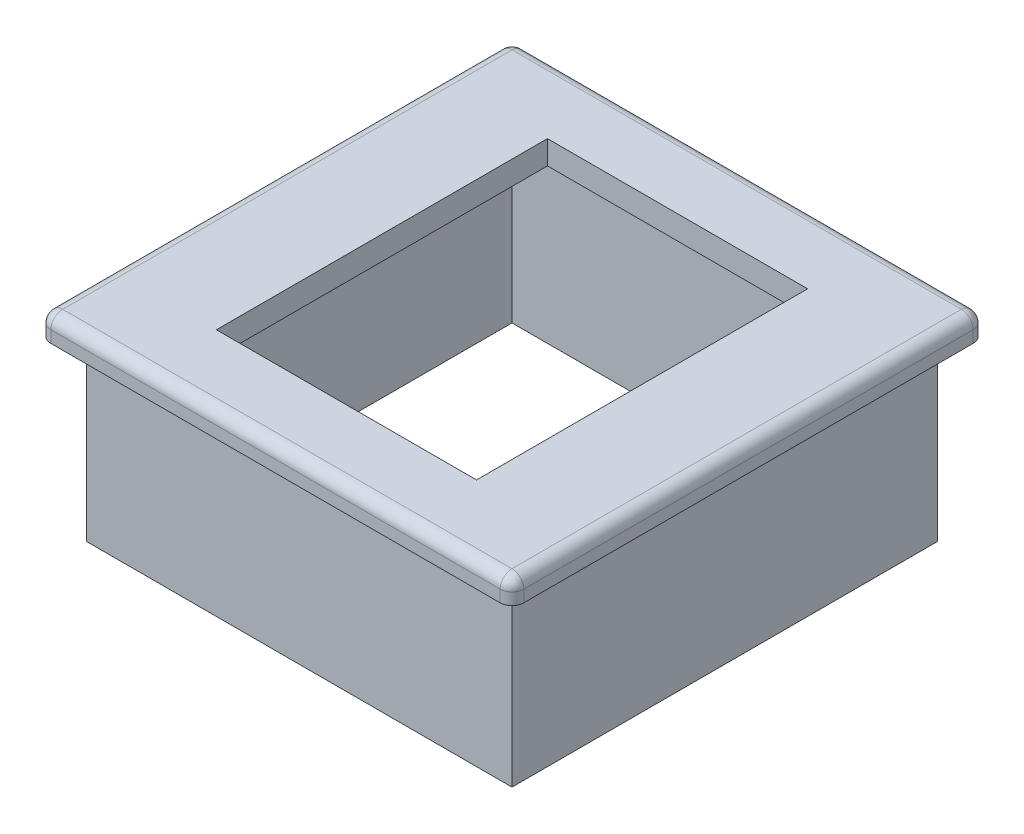
ISO-10303-21;
HEADER;
FILE_DESCRIPTION(('STEP AP214'),'2;1');
FILE_NAME('part.step','',(''),(''),'','','');
FILE_SCHEMA(('AUTOMOTIVE_DESIGN { 1 0 10303 214 1 1 1 1 }'));
ENDSEC;
DATA;
#1=APPLICATION_CONTEXT('core data for automotive mechanical design processes');
#2=APPLICATION_PROTOCOL_DEFINITION('international standard','automotive_design',2000,#1);
#3=PRODUCT_CONTEXT('',#1,'mechanical');
#4=PRODUCT('Part','Part','',(#3));
#5=PRODUCT_RELATED_PRODUCT_CATEGORY('part','',(#4));
#6=PRODUCT_DEFINITION_FORMATION('','',#4);
#7=PRODUCT_DEFINITION_CONTEXT('part definition',#1,'design');
#8=PRODUCT_DEFINITION('design','',#6,#7);
#9=PRODUCT_DEFINITION_SHAPE('','',#8);
#10=(LENGTH_UNIT() NAMED_UNIT(*) SI_UNIT(.MILLI.,.METRE.));
#11=(NAMED_UNIT(*) PLANE_ANGLE_UNIT() SI_UNIT($,.RADIAN.));
#12=(NAMED_UNIT(*) SI_UNIT($,.STERADIAN.) SOLID_ANGLE_UNIT());
#13=UNCERTAINTY_MEASURE_WITH_UNIT(LENGTH_MEASURE(1.E-05),#10,'distance_accuracy_value','');
#14=(GEOMETRIC_REPRESENTATION_CONTEXT(3) GLOBAL_UNCERTAINTY_ASSIGNED_CONTEXT((#13)) GLOBAL_UNIT_ASSIGNED_CONTEXT((#10,
#11,#12)) REPRESENTATION_CONTEXT('',''));
#15=CARTESIAN_POINT('',(0.,0.,0.));
#16=DIRECTION('',(0.,0.,1.));
#17=DIRECTION('',(1.,0.,0.));
#18=AXIS2_PLACEMENT_3D('',#15,#16,#17);
#19=CARTESIAN_POINT('',(0.,0.,0.));
#20=DIRECTION('',(0.,1.,0.));
#21=DIRECTION('',(0.,0.,1.));
#22=AXIS2_PLACEMENT_3D('',#19,#20,#21);
#23=PLANE('',#22);
#24=DIRECTION('',(0.,0.,-1.));
#25=VECTOR('',#24,1.);
#26=CARTESIAN_POINT('',(11.,0.,-14.));
#27=LINE('',#26,#25);
#28=CARTESIAN_POINT('',(11.,0.,14.));
#29=VERTEX_POINT('',#28);
#30=CARTESIAN_POINT('',(11.,0.,-14.));
#31=VERTEX_POINT('',#30);
#32=EDGE_CURVE('E253',#29,#31,#27,.T.);
#33=ORIENTED_EDGE('',*,*,#32,.T.);
#34=DIRECTION('',(-1.,0.,0.));
#35=VECTOR('',#34,1.);
#36=CARTESIAN_POINT('',(-11.,0.,-14.));
#37=LINE('',#36,#35);
#38=CARTESIAN_POINT('',(-11.,0.,-14.));
#39=VERTEX_POINT('',#38);
#40=EDGE_CURVE('E272',#31,#39,#37,.T.);
#41=ORIENTED_EDGE('',*,*,#40,.T.);
#42=DIRECTION('',(0.,0.,1.));
#43=VECTOR('',#42,1.);
#44=CARTESIAN_POINT('',(-11.,0.,-14.));
#45=LINE('',#44,#43);
#46=CARTESIAN_POINT('',(-11.,0.,14.));
#47=VERTEX_POINT('',#46);
#48=EDGE_CURVE('E275',#39,#47,#45,.T.);
#49=ORIENTED_EDGE('',*,*,#48,.T.);
#50=DIRECTION('',(1.,0.,0.));
#51=VECTOR('',#50,1.);
#52=CARTESIAN_POINT('',(-11.,0.,14.));
#53=LINE('',#52,#51);
#54=EDGE_CURVE('E262',#47,#29,#53,.T.);
#55=ORIENTED_EDGE('',*,*,#54,.T.);
#56=EDGE_LOOP('',(#33,#41,#49,#55));
#57=FACE_BOUND('',#56,.T.);
#58=DIRECTION('',(-1.,0.,0.));
#59=VECTOR('',#58,1.);
#60=CARTESIAN_POINT('',(0.,0.,-16.));
#61=LINE('',#60,#59);
#62=CARTESIAN_POINT('',(16.,0.,-16.));
#63=VERTEX_POINT('',#62);
#64=CARTESIAN_POINT('',(-16.,0.,-16.));
#65=VERTEX_POINT('',#64);
#66=EDGE_CURVE('E234',#63,#65,#61,.T.);
#67=ORIENTED_EDGE('',*,*,#66,.F.);
#68=DIRECTION('',(0.,0.,1.));
#69=VECTOR('',#68,1.);
#70=CARTESIAN_POINT('',(16.,0.,0.));
#71=LINE('',#70,#69);
#72=CARTESIAN_POINT('',(16.,0.,16.));
#73=VERTEX_POINT('',#72);
#74=EDGE_CURVE('E203',#63,#73,#71,.T.);
#75=ORIENTED_EDGE('',*,*,#74,.T.);
#76=DIRECTION('',(-1.,0.,0.));
#77=VECTOR('',#76,1.);
#78=CARTESIAN_POINT('',(0.,0.,16.));
#79=LINE('',#78,#77);
#80=CARTESIAN_POINT('',(-16.,0.,16.));
#81=VERTEX_POINT('',#80);
#82=EDGE_CURVE('E240',#73,#81,#79,.T.);
#83=ORIENTED_EDGE('',*,*,#82,.T.);
#84=DIRECTION('',(0.,0.,1.));
#85=VECTOR('',#84,1.);
#86=CARTESIAN_POINT('',(-16.,0.,0.));
#87=LINE('',#86,#85);
#88=EDGE_CURVE('E237',#65,#81,#87,.T.);
#89=ORIENTED_EDGE('',*,*,#88,.F.);
#90=EDGE_LOOP('',(#67,#75,#83,#89));
#91=FACE_BOUND('',#90,.T.);
#92=ADVANCED_FACE('F35',(#57,#91),#23,.F.);
#93=CARTESIAN_POINT('',(0.,2.,0.));
#94=DIRECTION('',(0.,1.,0.));
#95=DIRECTION('',(0.,0.,1.));
#96=AXIS2_PLACEMENT_3D('',#93,#94,#95);
#97=PLANE('',#96);
#98=DIRECTION('',(1.,0.,0.));
#99=VECTOR('',#98,1.);
#100=CARTESIAN_POINT('',(20.,2.,19.));
#101=LINE('',#100,#99);
#102=CARTESIAN_POINT('',(-19.,2.,19.));
#103=VERTEX_POINT('',#102);
#104=CARTESIAN_POINT('',(19.,2.,19.));
#105=VERTEX_POINT('',#104);
#106=EDGE_CURVE('E325',#103,#105,#101,.T.);
#107=ORIENTED_EDGE('',*,*,#106,.T.);
#108=DIRECTION('',(0.,0.,-1.));
#109=VECTOR('',#108,1.);
#110=CARTESIAN_POINT('',(19.,2.,-20.));
#111=LINE('',#110,#109);
#112=CARTESIAN_POINT('',(19.,2.,-19.));
#113=VERTEX_POINT('',#112);
#114=EDGE_CURVE('E327',#105,#113,#111,.T.);
#115=ORIENTED_EDGE('',*,*,#114,.T.);
#116=DIRECTION('',(-1.,0.,0.));
#117=VECTOR('',#116,1.);
#118=CARTESIAN_POINT('',(-20.,2.,-19.));
#119=LINE('',#118,#117);
#120=CARTESIAN_POINT('',(-19.,2.,-19.));
#121=VERTEX_POINT('',#120);
#122=EDGE_CURVE('E321',#113,#121,#119,.T.);
#123=ORIENTED_EDGE('',*,*,#122,.T.);
#124=DIRECTION('',(0.,0.,1.));
#125=VECTOR('',#124,1.);
#126=CARTESIAN_POINT('',(-19.,2.,20.));
#127=LINE('',#126,#125);
#128=EDGE_CURVE('E323',#121,#103,#127,.T.);
#129=ORIENTED_EDGE('',*,*,#128,.T.);
#130=EDGE_LOOP('',(#107,#115,#123,#129));
#131=FACE_BOUND('',#130,.T.);
#132=DIRECTION('',(-1.,0.,0.));
#133=VECTOR('',#132,1.);
#134=CARTESIAN_POINT('',(-11.,2.,-14.));
#135=LINE('',#134,#133);
#136=CARTESIAN_POINT('',(11.,2.,-14.));
#137=VERTEX_POINT('',#136);
#138=CARTESIAN_POINT('',(-11.,2.,-14.));
#139=VERTEX_POINT('',#138);
#140=EDGE_CURVE('E261',#137,#139,#135,.T.);
#141=ORIENTED_EDGE('',*,*,#140,.F.);
#142=DIRECTION('',(0.,0.,-1.));
#143=VECTOR('',#142,1.);
#144=CARTESIAN_POINT('',(11.,2.,-14.));
#145=LINE('',#144,#143);
#146=CARTESIAN_POINT('',(11.,2.,14.));
#147=VERTEX_POINT('',#146);
#148=EDGE_CURVE('E259',#147,#137,#145,.T.);
#149=ORIENTED_EDGE('',*,*,#148,.F.);
#150=DIRECTION('',(1.,0.,0.));
#151=VECTOR('',#150,1.);
#152=CARTESIAN_POINT('',(-11.,2.,14.));
#153=LINE('',#152,#151);
#154=CARTESIAN_POINT('',(-11.,2.,14.));
#155=VERTEX_POINT('',#154);
#156=EDGE_CURVE('E267',#155,#147,#153,.T.);
#157=ORIENTED_EDGE('',*,*,#156,.F.);
#158=DIRECTION('',(0.,0.,1.));
#159=VECTOR('',#158,1.);
#160=CARTESIAN_POINT('',(-11.,2.,-14.));
#161=LINE('',#160,#159);
#162=EDGE_CURVE('E264',#139,#155,#161,.T.);
#163=ORIENTED_EDGE('',*,*,#162,.F.);
#164=EDGE_LOOP('',(#141,#149,#157,#163));
#165=FACE_BOUND('',#164,.T.);
#166=ADVANCED_FACE('F400',(#131,#165),#97,.T.);
#167=DIRECTION('',(1.,0.,0.));
#168=VECTOR('',#167,1.);
#169=CARTESIAN_POINT('',(0.,0.,18.));
#170=LINE('',#169,#168);
#171=CARTESIAN_POINT('',(-18.,0.,18.));
#172=VERTEX_POINT('',#171);
#173=CARTESIAN_POINT('',(18.,0.,18.));
#174=VERTEX_POINT('',#173);
#175=EDGE_CURVE('E226',#172,#174,#170,.T.);
#176=ORIENTED_EDGE('',*,*,#175,.T.);
#177=DIRECTION('',(0.,0.,-1.));
#178=VECTOR('',#177,1.);
#179=CARTESIAN_POINT('',(18.,0.,0.));
#180=LINE('',#179,#178);
#181=CARTESIAN_POINT('',(18.,0.,-18.));
#182=VERTEX_POINT('',#181);
#183=EDGE_CURVE('E188',#174,#182,#180,.T.);
#184=ORIENTED_EDGE('',*,*,#183,.T.);
#185=DIRECTION('',(1.,0.,0.));
#186=VECTOR('',#185,1.);
#187=CARTESIAN_POINT('',(0.,0.,-18.));
#188=LINE('',#187,#186);
#189=CARTESIAN_POINT('',(-18.,0.,-18.));
#190=VERTEX_POINT('',#189);
#191=EDGE_CURVE('E231',#190,#182,#188,.T.);
#192=ORIENTED_EDGE('',*,*,#191,.F.);
#193=DIRECTION('',(0.,0.,-1.));
#194=VECTOR('',#193,1.);
#195=CARTESIAN_POINT('',(-18.,0.,0.));
#196=LINE('',#195,#194);
#197=EDGE_CURVE('E228',#172,#190,#196,.T.);
#198=ORIENTED_EDGE('',*,*,#197,.F.);
#199=EDGE_LOOP('',(#176,#184,#192,#198));
#200=FACE_BOUND('',#199,.T.);
#201=DIRECTION('',(1.,0.,0.));
#202=VECTOR('',#201,1.);
#203=CARTESIAN_POINT('',(-20.,0.,20.));
#204=LINE('',#203,#202);
#205=CARTESIAN_POINT('',(-19.,0.,20.));
#206=VERTEX_POINT('',#205);
#207=CARTESIAN_POINT('',(19.,0.,20.));
#208=VERTEX_POINT('',#207);
#209=EDGE_CURVE('E297',#206,#208,#204,.T.);
#210=ORIENTED_EDGE('',*,*,#209,.F.);
#211=CARTESIAN_POINT('',(-19.,0.,19.));
#212=DIRECTION('',(0.,1.,0.));
#213=DIRECTION('',(0.,0.,1.));
#214=AXIS2_PLACEMENT_3D('',#211,#212,#213);
#215=CIRCLE('',#214,1.);
#216=CARTESIAN_POINT('',(-20.,0.,19.));
#217=VERTEX_POINT('',#216);
#218=EDGE_CURVE('E313',#206,#217,#215,.F.);
#219=ORIENTED_EDGE('',*,*,#218,.T.);
#220=DIRECTION('',(0.,0.,1.));
#221=VECTOR('',#220,1.);
#222=CARTESIAN_POINT('',(-20.,0.,-20.));
#223=LINE('',#222,#221);
#224=CARTESIAN_POINT('',(-20.,0.,-19.));
#225=VERTEX_POINT('',#224);
#226=EDGE_CURVE('E294',#225,#217,#223,.T.);
#227=ORIENTED_EDGE('',*,*,#226,.F.);
#228=CARTESIAN_POINT('',(-19.,0.,-19.));
#229=DIRECTION('',(0.,1.,0.));
#230=DIRECTION('',(0.,0.,1.));
#231=AXIS2_PLACEMENT_3D('',#228,#229,#230);
#232=CIRCLE('',#231,1.);
#233=CARTESIAN_POINT('',(-19.,0.,-20.));
#234=VERTEX_POINT('',#233);
#235=EDGE_CURVE('E311',#225,#234,#232,.F.);
#236=ORIENTED_EDGE('',*,*,#235,.T.);
#237=DIRECTION('',(-1.,0.,0.));
#238=VECTOR('',#237,1.);
#239=CARTESIAN_POINT('',(-20.,0.,-20.));
#240=LINE('',#239,#238);
#241=CARTESIAN_POINT('',(19.,0.,-20.));
#242=VERTEX_POINT('',#241);
#243=EDGE_CURVE('E292',#242,#234,#240,.T.);
#244=ORIENTED_EDGE('',*,*,#243,.F.);
#245=CARTESIAN_POINT('',(19.,0.,-19.));
#246=DIRECTION('',(0.,1.,0.));
#247=DIRECTION('',(0.,0.,1.));
#248=AXIS2_PLACEMENT_3D('',#245,#246,#247);
#249=CIRCLE('',#248,1.);
#250=CARTESIAN_POINT('',(20.,0.,-19.));
#251=VERTEX_POINT('',#250);
#252=EDGE_CURVE('E309',#242,#251,#249,.F.);
#253=ORIENTED_EDGE('',*,*,#252,.T.);
#254=DIRECTION('',(0.,0.,-1.));
#255=VECTOR('',#254,1.);
#256=CARTESIAN_POINT('',(20.,0.,-20.));
#257=LINE('',#256,#255);
#258=CARTESIAN_POINT('',(20.,0.,19.));
#259=VERTEX_POINT('',#258);
#260=EDGE_CURVE('E289',#259,#251,#257,.T.);
#261=ORIENTED_EDGE('',*,*,#260,.F.);
#262=CARTESIAN_POINT('',(19.,0.,19.));
#263=DIRECTION('',(0.,1.,0.));
#264=DIRECTION('',(0.,0.,1.));
#265=AXIS2_PLACEMENT_3D('',#262,#263,#264);
#266=CIRCLE('',#265,1.);
#267=EDGE_CURVE('E307',#259,#208,#266,.F.);
#268=ORIENTED_EDGE('',*,*,#267,.T.);
#269=EDGE_LOOP('',(#210,#219,#227,#236,#244,#253,#261,#268));
#270=FACE_BOUND('',#269,.T.);
#271=ADVANCED_FACE('F385',(#200,#270),#23,.F.);
#272=CARTESIAN_POINT('',(20.,2.,-20.));
#273=DIRECTION('',(-1.,0.,0.));
#274=DIRECTION('',(0.,0.,1.));
#275=AXIS2_PLACEMENT_3D('',#272,#273,#274);
#276=PLANE('',#275);
#277=ORIENTED_EDGE('',*,*,#260,.T.);
#278=DIRECTION('',(0.,-1.,0.));
#279=VECTOR('',#278,1.);
#280=CARTESIAN_POINT('',(20.,2.,-19.));
#281=LINE('',#280,#279);
#282=CARTESIAN_POINT('',(20.,1.,-19.));
#283=VERTEX_POINT('',#282);
#284=EDGE_CURVE('E334',#251,#283,#281,.F.);
#285=ORIENTED_EDGE('',*,*,#284,.T.);
#286=DIRECTION('',(0.,0.,-1.));
#287=VECTOR('',#286,1.);
#288=CARTESIAN_POINT('',(20.,1.,20.));
#289=LINE('',#288,#287);
#290=CARTESIAN_POINT('',(20.,1.,19.));
#291=VERTEX_POINT('',#290);
#292=EDGE_CURVE('E332',#283,#291,#289,.F.);
#293=ORIENTED_EDGE('',*,*,#292,.T.);
#294=DIRECTION('',(0.,-1.,0.));
#295=VECTOR('',#294,1.);
#296=CARTESIAN_POINT('',(20.,2.,19.));
#297=LINE('',#296,#295);
#298=EDGE_CURVE('E330',#291,#259,#297,.T.);
#299=ORIENTED_EDGE('',*,*,#298,.T.);
#300=EDGE_LOOP('',(#277,#285,#293,#299));
#301=FACE_BOUND('',#300,.T.);
#302=ADVANCED_FACE('F426',(#301),#276,.F.);
#303=CARTESIAN_POINT('',(-20.,2.,-20.));
#304=DIRECTION('',(0.,0.,1.));
#305=DIRECTION('',(1.,0.,0.));
#306=AXIS2_PLACEMENT_3D('',#303,#304,#305);
#307=PLANE('',#306);
#308=ORIENTED_EDGE('',*,*,#243,.T.);
#309=DIRECTION('',(0.,-1.,0.));
#310=VECTOR('',#309,1.);
#311=CARTESIAN_POINT('',(-19.,2.,-20.));
#312=LINE('',#311,#310);
#313=CARTESIAN_POINT('',(-19.,1.,-20.));
#314=VERTEX_POINT('',#313);
#315=EDGE_CURVE('E11',#234,#314,#312,.F.);
#316=ORIENTED_EDGE('',*,*,#315,.T.);
#317=DIRECTION('',(-1.,0.,0.));
#318=VECTOR('',#317,1.);
#319=CARTESIAN_POINT('',(20.,1.,-20.));
#320=LINE('',#319,#318);
#321=CARTESIAN_POINT('',(19.,1.,-20.));
#322=VERTEX_POINT('',#321);
#323=EDGE_CURVE('E44',#314,#322,#320,.F.);
#324=ORIENTED_EDGE('',*,*,#323,.T.);
#325=DIRECTION('',(0.,-1.,0.));
#326=VECTOR('',#325,1.);
#327=CARTESIAN_POINT('',(19.,2.,-20.));
#328=LINE('',#327,#326);
#329=EDGE_CURVE('E336',#322,#242,#328,.T.);
#330=ORIENTED_EDGE('',*,*,#329,.T.);
#331=EDGE_LOOP('',(#308,#316,#324,#330));
#332=FACE_BOUND('',#331,.T.);
#333=ADVANCED_FACE('F382',(#332),#307,.F.);
#334=CARTESIAN_POINT('',(-20.,2.,-20.));
#335=DIRECTION('',(1.,0.,0.));
#336=DIRECTION('',(0.,0.,-1.));
#337=AXIS2_PLACEMENT_3D('',#334,#335,#336);
#338=PLANE('',#337);
#339=ORIENTED_EDGE('',*,*,#226,.T.);
#340=DIRECTION('',(0.,-1.,0.));
#341=VECTOR('',#340,1.);
#342=CARTESIAN_POINT('',(-20.,2.,19.));
#343=LINE('',#342,#341);
#344=CARTESIAN_POINT('',(-20.,1.,19.));
#345=VERTEX_POINT('',#344);
#346=EDGE_CURVE('E319',#217,#345,#343,.F.);
#347=ORIENTED_EDGE('',*,*,#346,.T.);
#348=DIRECTION('',(0.,0.,1.));
#349=VECTOR('',#348,1.);
#350=CARTESIAN_POINT('',(-20.,1.,-20.));
#351=LINE('',#350,#349);
#352=CARTESIAN_POINT('',(-20.,1.,-19.));
#353=VERTEX_POINT('',#352);
#354=EDGE_CURVE('E317',#345,#353,#351,.F.);
#355=ORIENTED_EDGE('',*,*,#354,.T.);
#356=DIRECTION('',(0.,-1.,0.));
#357=VECTOR('',#356,1.);
#358=CARTESIAN_POINT('',(-20.,2.,-19.));
#359=LINE('',#358,#357);
#360=EDGE_CURVE('E315',#353,#225,#359,.T.);
#361=ORIENTED_EDGE('',*,*,#360,.T.);
#362=EDGE_LOOP('',(#339,#347,#355,#361));
#363=FACE_BOUND('',#362,.T.);
#364=ADVANCED_FACE('F430',(#363),#338,.F.);
#365=CARTESIAN_POINT('',(-20.,2.,20.));
#366=DIRECTION('',(0.,0.,-1.));
#367=DIRECTION('',(-1.,0.,0.));
#368=AXIS2_PLACEMENT_3D('',#365,#366,#367);
#369=PLANE('',#368);
#370=DIRECTION('',(1.,0.,0.));
#371=VECTOR('',#370,1.);
#372=CARTESIAN_POINT('',(-20.,1.,20.));
#373=LINE('',#372,#371);
#374=CARTESIAN_POINT('',(19.,1.,20.));
#375=VERTEX_POINT('',#374);
#376=CARTESIAN_POINT('',(-19.,1.,20.));
#377=VERTEX_POINT('',#376);
#378=EDGE_CURVE('E302',#375,#377,#373,.F.);
#379=ORIENTED_EDGE('',*,*,#378,.T.);
#380=DIRECTION('',(0.,-1.,0.));
#381=VECTOR('',#380,1.);
#382=CARTESIAN_POINT('',(-19.,2.,20.));
#383=LINE('',#382,#381);
#384=EDGE_CURVE('E304',#377,#206,#383,.T.);
#385=ORIENTED_EDGE('',*,*,#384,.T.);
#386=ORIENTED_EDGE('',*,*,#209,.T.);
#387=DIRECTION('',(0.,-1.,0.));
#388=VECTOR('',#387,1.);
#389=CARTESIAN_POINT('',(19.,2.,20.));
#390=LINE('',#389,#388);
#391=EDGE_CURVE('E300',#208,#375,#390,.F.);
#392=ORIENTED_EDGE('',*,*,#391,.T.);
#393=EDGE_LOOP('',(#379,#385,#386,#392));
#394=FACE_BOUND('',#393,.T.);
#395=ADVANCED_FACE('F418',(#394),#369,.F.);
#396=CARTESIAN_POINT('',(11.,2.,-14.));
#397=DIRECTION('',(-1.,0.,0.));
#398=DIRECTION('',(0.,0.,1.));
#399=AXIS2_PLACEMENT_3D('',#396,#397,#398);
#400=PLANE('',#399);
#401=ORIENTED_EDGE('',*,*,#32,.F.);
#402=DIRECTION('',(0.,-1.,0.));
#403=VECTOR('',#402,1.);
#404=CARTESIAN_POINT('',(11.,2.,14.));
#405=LINE('',#404,#403);
#406=EDGE_CURVE('E269',#147,#29,#405,.T.);
#407=ORIENTED_EDGE('',*,*,#406,.F.);
#408=ORIENTED_EDGE('',*,*,#148,.T.);
#409=DIRECTION('',(0.,-1.,0.));
#410=VECTOR('',#409,1.);
#411=CARTESIAN_POINT('',(11.,2.,-14.));
#412=LINE('',#411,#410);
#413=EDGE_CURVE('E286',#137,#31,#412,.T.);
#414=ORIENTED_EDGE('',*,*,#413,.T.);
#415=EDGE_LOOP('',(#401,#407,#408,#414));
#416=FACE_BOUND('',#415,.T.);
#417=ADVANCED_FACE('F495',(#416),#400,.T.);
#418=CARTESIAN_POINT('',(-11.,2.,-14.));
#419=DIRECTION('',(0.,0.,1.));
#420=DIRECTION('',(1.,0.,0.));
#421=AXIS2_PLACEMENT_3D('',#418,#419,#420);
#422=PLANE('',#421);
#423=ORIENTED_EDGE('',*,*,#40,.F.);
#424=ORIENTED_EDGE('',*,*,#413,.F.);
#425=ORIENTED_EDGE('',*,*,#140,.T.);
#426=DIRECTION('',(0.,-1.,0.));
#427=VECTOR('',#426,1.);
#428=CARTESIAN_POINT('',(-11.,2.,-14.));
#429=LINE('',#428,#427);
#430=EDGE_CURVE('E284',#139,#39,#429,.T.);
#431=ORIENTED_EDGE('',*,*,#430,.T.);
#432=EDGE_LOOP('',(#423,#424,#425,#431));
#433=FACE_BOUND('',#432,.T.);
#434=ADVANCED_FACE('F491',(#433),#422,.T.);
#435=CARTESIAN_POINT('',(-11.,2.,-14.));
#436=DIRECTION('',(1.,0.,0.));
#437=DIRECTION('',(0.,0.,-1.));
#438=AXIS2_PLACEMENT_3D('',#435,#436,#437);
#439=PLANE('',#438);
#440=ORIENTED_EDGE('',*,*,#48,.F.);
#441=ORIENTED_EDGE('',*,*,#430,.F.);
#442=ORIENTED_EDGE('',*,*,#162,.T.);
#443=DIRECTION('',(0.,-1.,0.));
#444=VECTOR('',#443,1.);
#445=CARTESIAN_POINT('',(-11.,2.,14.));
#446=LINE('',#445,#444);
#447=EDGE_CURVE('E282',#155,#47,#446,.T.);
#448=ORIENTED_EDGE('',*,*,#447,.T.);
#449=EDGE_LOOP('',(#440,#441,#442,#448));
#450=FACE_BOUND('',#449,.T.);
#451=ADVANCED_FACE('F487',(#450),#439,.T.);
#452=CARTESIAN_POINT('',(-11.,2.,14.));
#453=DIRECTION('',(0.,0.,-1.));
#454=DIRECTION('',(-1.,0.,0.));
#455=AXIS2_PLACEMENT_3D('',#452,#453,#454);
#456=PLANE('',#455);
#457=ORIENTED_EDGE('',*,*,#54,.F.);
#458=ORIENTED_EDGE('',*,*,#447,.F.);
#459=ORIENTED_EDGE('',*,*,#156,.T.);
#460=ORIENTED_EDGE('',*,*,#406,.T.);
#461=EDGE_LOOP('',(#457,#458,#459,#460));
#462=FACE_BOUND('',#461,.T.);
#463=ADVANCED_FACE('F484',(#462),#456,.T.);
#464=CARTESIAN_POINT('',(0.,-15.,-16.));
#465=DIRECTION('',(0.,0.,-1.));
#466=DIRECTION('',(-1.,0.,0.));
#467=AXIS2_PLACEMENT_3D('',#464,#465,#466);
#468=PLANE('',#467);
#469=ORIENTED_EDGE('',*,*,#66,.T.);
#470=DIRECTION('',(0.,1.,0.));
#471=VECTOR('',#470,1.);
#472=CARTESIAN_POINT('',(-16.,-15.,-16.));
#473=LINE('',#472,#471);
#474=CARTESIAN_POINT('',(-16.,-15.,-16.));
#475=VERTEX_POINT('',#474);
#476=EDGE_CURVE('E251',#475,#65,#473,.T.);
#477=ORIENTED_EDGE('',*,*,#476,.F.);
#478=DIRECTION('',(-1.,0.,0.));
#479=VECTOR('',#478,1.);
#480=CARTESIAN_POINT('',(0.,-15.,-16.));
#481=LINE('',#480,#479);
#482=CARTESIAN_POINT('',(16.,-15.,-16.));
#483=VERTEX_POINT('',#482);
#484=EDGE_CURVE('E213',#483,#475,#481,.T.);
#485=ORIENTED_EDGE('',*,*,#484,.F.);
#486=DIRECTION('',(0.,1.,0.));
#487=VECTOR('',#486,1.);
#488=CARTESIAN_POINT('',(16.,-15.,-16.));
#489=LINE('',#488,#487);
#490=EDGE_CURVE('E192',#483,#63,#489,.T.);
#491=ORIENTED_EDGE('',*,*,#490,.T.);
#492=EDGE_LOOP('',(#469,#477,#485,#491));
#493=FACE_BOUND('',#492,.T.);
#494=ADVANCED_FACE('F476',(#493),#468,.F.);
#495=CARTESIAN_POINT('',(-16.,-15.,0.));
#496=DIRECTION('',(-1.,0.,0.));
#497=DIRECTION('',(0.,0.,1.));
#498=AXIS2_PLACEMENT_3D('',#495,#496,#497);
#499=PLANE('',#498);
#500=ORIENTED_EDGE('',*,*,#88,.T.);
#501=DIRECTION('',(0.,1.,0.));
#502=VECTOR('',#501,1.);
#503=CARTESIAN_POINT('',(-16.,-15.,16.));
#504=LINE('',#503,#502);
#505=CARTESIAN_POINT('',(-16.,-15.,16.));
#506=VERTEX_POINT('',#505);
#507=EDGE_CURVE('E249',#506,#81,#504,.T.);
#508=ORIENTED_EDGE('',*,*,#507,.F.);
#509=DIRECTION('',(0.,0.,1.));
#510=VECTOR('',#509,1.);
#511=CARTESIAN_POINT('',(-16.,-15.,0.));
#512=LINE('',#511,#510);
#513=EDGE_CURVE('E216',#475,#506,#512,.T.);
#514=ORIENTED_EDGE('',*,*,#513,.F.);
#515=ORIENTED_EDGE('',*,*,#476,.T.);
#516=EDGE_LOOP('',(#500,#508,#514,#515));
#517=FACE_BOUND('',#516,.T.);
#518=ADVANCED_FACE('F633',(#517),#499,.F.);
#519=CARTESIAN_POINT('',(0.,-15.,16.));
#520=DIRECTION('',(0.,0.,-1.));
#521=DIRECTION('',(-1.,0.,0.));
#522=AXIS2_PLACEMENT_3D('',#519,#520,#521);
#523=PLANE('',#522);
#524=ORIENTED_EDGE('',*,*,#82,.F.);
#525=DIRECTION('',(0.,1.,0.));
#526=VECTOR('',#525,1.);
#527=CARTESIAN_POINT('',(16.,-15.,16.));
#528=LINE('',#527,#526);
#529=CARTESIAN_POINT('',(16.,-15.,16.));
#530=VERTEX_POINT('',#529);
#531=EDGE_CURVE('E246',#530,#73,#528,.T.);
#532=ORIENTED_EDGE('',*,*,#531,.F.);
#533=DIRECTION('',(-1.,0.,0.));
#534=VECTOR('',#533,1.);
#535=CARTESIAN_POINT('',(0.,-15.,16.));
#536=LINE('',#535,#534);
#537=EDGE_CURVE('E218',#530,#506,#536,.T.);
#538=ORIENTED_EDGE('',*,*,#537,.T.);
#539=ORIENTED_EDGE('',*,*,#507,.T.);
#540=EDGE_LOOP('',(#524,#532,#538,#539));
#541=FACE_BOUND('',#540,.T.);
#542=ADVANCED_FACE('F483',(#541),#523,.T.);
#543=CARTESIAN_POINT('',(18.,-15.,0.));
#544=DIRECTION('',(1.,0.,0.));
#545=DIRECTION('',(0.,0.,-1.));
#546=AXIS2_PLACEMENT_3D('',#543,#544,#545);
#547=PLANE('',#546);
#548=ORIENTED_EDGE('',*,*,#183,.F.);
#549=DIRECTION('',(0.,1.,0.));
#550=VECTOR('',#549,1.);
#551=CARTESIAN_POINT('',(18.,-15.,18.));
#552=LINE('',#551,#550);
#553=CARTESIAN_POINT('',(18.,-15.,18.));
#554=VERTEX_POINT('',#553);
#555=EDGE_CURVE('E183',#554,#174,#552,.T.);
#556=ORIENTED_EDGE('',*,*,#555,.F.);
#557=DIRECTION('',(0.,0.,-1.));
#558=VECTOR('',#557,1.);
#559=CARTESIAN_POINT('',(18.,-15.,0.));
#560=LINE('',#559,#558);
#561=CARTESIAN_POINT('',(18.,-15.,-18.));
#562=VERTEX_POINT('',#561);
#563=EDGE_CURVE('E187',#554,#562,#560,.T.);
#564=ORIENTED_EDGE('',*,*,#563,.T.);
#565=DIRECTION('',(0.,1.,0.));
#566=VECTOR('',#565,1.);
#567=CARTESIAN_POINT('',(18.,-15.,-18.));
#568=LINE('',#567,#566);
#569=EDGE_CURVE('E224',#562,#182,#568,.T.);
#570=ORIENTED_EDGE('',*,*,#569,.T.);
#571=EDGE_LOOP('',(#548,#556,#564,#570));
#572=FACE_BOUND('',#571,.T.);
#573=ADVANCED_FACE('F185',(#572),#547,.T.);
#574=CARTESIAN_POINT('',(0.,-15.,18.));
#575=DIRECTION('',(0.,0.,1.));
#576=DIRECTION('',(1.,0.,0.));
#577=AXIS2_PLACEMENT_3D('',#574,#575,#576);
#578=PLANE('',#577);
#579=ORIENTED_EDGE('',*,*,#175,.F.);
#580=DIRECTION('',(0.,1.,0.));
#581=VECTOR('',#580,1.);
#582=CARTESIAN_POINT('',(-18.,-15.,18.));
#583=LINE('',#582,#581);
#584=CARTESIAN_POINT('',(-18.,-15.,18.));
#585=VERTEX_POINT('',#584);
#586=EDGE_CURVE('E193',#585,#172,#583,.T.);
#587=ORIENTED_EDGE('',*,*,#586,.F.);
#588=DIRECTION('',(1.,0.,0.));
#589=VECTOR('',#588,1.);
#590=CARTESIAN_POINT('',(0.,-15.,18.));
#591=LINE('',#590,#589);
#592=EDGE_CURVE('E199',#585,#554,#591,.T.);
#593=ORIENTED_EDGE('',*,*,#592,.T.);
#594=ORIENTED_EDGE('',*,*,#555,.T.);
#595=EDGE_LOOP('',(#579,#587,#593,#594));
#596=FACE_BOUND('',#595,.T.);
#597=ADVANCED_FACE('F205',(#596),#578,.T.);
#598=CARTESIAN_POINT('',(-18.,-15.,0.));
#599=DIRECTION('',(1.,0.,0.));
#600=DIRECTION('',(0.,0.,-1.));
#601=AXIS2_PLACEMENT_3D('',#598,#599,#600);
#602=PLANE('',#601);
#603=ORIENTED_EDGE('',*,*,#197,.T.);
#604=DIRECTION('',(0.,1.,0.));
#605=VECTOR('',#604,1.);
#606=CARTESIAN_POINT('',(-18.,-15.,-18.));
#607=LINE('',#606,#605);
#608=CARTESIAN_POINT('',(-18.,-15.,-18.));
#609=VERTEX_POINT('',#608);
#610=EDGE_CURVE('E255',#609,#190,#607,.T.);
#611=ORIENTED_EDGE('',*,*,#610,.F.);
#612=DIRECTION('',(0.,0.,-1.));
#613=VECTOR('',#612,1.);
#614=CARTESIAN_POINT('',(-18.,-15.,0.));
#615=LINE('',#614,#613);
#616=EDGE_CURVE('E208',#585,#609,#615,.T.);
#617=ORIENTED_EDGE('',*,*,#616,.F.);
#618=ORIENTED_EDGE('',*,*,#586,.T.);
#619=EDGE_LOOP('',(#603,#611,#617,#618));
#620=FACE_BOUND('',#619,.T.);
#621=ADVANCED_FACE('F462',(#620),#602,.F.);
#622=CARTESIAN_POINT('',(0.,-15.,-18.));
#623=DIRECTION('',(0.,0.,1.));
#624=DIRECTION('',(1.,0.,0.));
#625=AXIS2_PLACEMENT_3D('',#622,#623,#624);
#626=PLANE('',#625);
#627=ORIENTED_EDGE('',*,*,#191,.T.);
#628=ORIENTED_EDGE('',*,*,#569,.F.);
#629=DIRECTION('',(1.,0.,0.));
#630=VECTOR('',#629,1.);
#631=CARTESIAN_POINT('',(0.,-15.,-18.));
#632=LINE('',#631,#630);
#633=EDGE_CURVE('E201',#609,#562,#632,.T.);
#634=ORIENTED_EDGE('',*,*,#633,.F.);
#635=ORIENTED_EDGE('',*,*,#610,.T.);
#636=EDGE_LOOP('',(#627,#628,#634,#635));
#637=FACE_BOUND('',#636,.T.);
#638=ADVANCED_FACE('F464',(#637),#626,.F.);
#639=CARTESIAN_POINT('',(16.,-15.,0.));
#640=DIRECTION('',(-1.,0.,0.));
#641=DIRECTION('',(0.,0.,1.));
#642=AXIS2_PLACEMENT_3D('',#639,#640,#641);
#643=PLANE('',#642);
#644=ORIENTED_EDGE('',*,*,#74,.F.);
#645=ORIENTED_EDGE('',*,*,#490,.F.);
#646=DIRECTION('',(0.,0.,1.));
#647=VECTOR('',#646,1.);
#648=CARTESIAN_POINT('',(16.,-15.,0.));
#649=LINE('',#648,#647);
#650=EDGE_CURVE('E221',#483,#530,#649,.T.);
#651=ORIENTED_EDGE('',*,*,#650,.T.);
#652=ORIENTED_EDGE('',*,*,#531,.T.);
#653=EDGE_LOOP('',(#644,#645,#651,#652));
#654=FACE_BOUND('',#653,.T.);
#655=ADVANCED_FACE('F466',(#654),#643,.T.);
#656=CARTESIAN_POINT('',(0.,-15.,0.));
#657=DIRECTION('',(0.,-1.,0.));
#658=DIRECTION('',(0.,0.,-1.));
#659=AXIS2_PLACEMENT_3D('',#656,#657,#658);
#660=PLANE('',#659);
#661=ORIENTED_EDGE('',*,*,#563,.F.);
#662=ORIENTED_EDGE('',*,*,#592,.F.);
#663=ORIENTED_EDGE('',*,*,#616,.T.);
#664=ORIENTED_EDGE('',*,*,#633,.T.);
#665=EDGE_LOOP('',(#661,#662,#663,#664));
#666=FACE_BOUND('',#665,.T.);
#667=ORIENTED_EDGE('',*,*,#484,.T.);
#668=ORIENTED_EDGE('',*,*,#513,.T.);
#669=ORIENTED_EDGE('',*,*,#537,.F.);
#670=ORIENTED_EDGE('',*,*,#650,.F.);
#671=EDGE_LOOP('',(#667,#668,#669,#670));
#672=FACE_BOUND('',#671,.T.);
#673=ADVANCED_FACE('F197',(#666,#672),#660,.T.);
#674=CARTESIAN_POINT('',(19.,2.,-19.));
#675=DIRECTION('',(0.,-1.,0.));
#676=DIRECTION('',(0.,0.,-1.));
#677=AXIS2_PLACEMENT_3D('',#674,#675,#676);
#678=CYLINDRICAL_SURFACE('',#677,1.);
#679=CARTESIAN_POINT('',(19.,1.,-19.));
#680=DIRECTION('',(0.,1.,0.));
#681=DIRECTION('',(0.,0.,1.));
#682=AXIS2_PLACEMENT_3D('',#679,#680,#681);
#683=CIRCLE('',#682,1.);
#684=EDGE_CURVE('E39',#283,#322,#683,.T.);
#685=ORIENTED_EDGE('',*,*,#684,.F.);
#686=ORIENTED_EDGE('',*,*,#284,.F.);
#687=ORIENTED_EDGE('',*,*,#252,.F.);
#688=ORIENTED_EDGE('',*,*,#329,.F.);
#689=EDGE_LOOP('',(#685,#686,#687,#688));
#690=FACE_BOUND('',#689,.T.);
#691=ADVANCED_FACE('F37',(#690),#678,.T.);
#692=CARTESIAN_POINT('',(19.,1.,-19.));
#693=DIRECTION('',(0.,0.,1.));
#694=DIRECTION('',(1.,0.,0.));
#695=AXIS2_PLACEMENT_3D('',#692,#693,#694);
#696=SPHERICAL_SURFACE('',#695,1.);
#697=CARTESIAN_POINT('',(19.,1.,-19.));
#698=DIRECTION('',(0.,0.,-1.));
#699=DIRECTION('',(-1.,0.,0.));
#700=AXIS2_PLACEMENT_3D('',#697,#698,#699);
#701=CIRCLE('',#700,1.);
#702=EDGE_CURVE('E366',#283,#113,#701,.F.);
#703=ORIENTED_EDGE('',*,*,#702,.F.);
#704=ORIENTED_EDGE('',*,*,#684,.T.);
#705=CARTESIAN_POINT('',(19.,1.,-19.));
#706=DIRECTION('',(1.,0.,0.));
#707=DIRECTION('',(0.,0.,-1.));
#708=AXIS2_PLACEMENT_3D('',#705,#706,#707);
#709=CIRCLE('',#708,1.);
#710=EDGE_CURVE('E368',#113,#322,#709,.F.);
#711=ORIENTED_EDGE('',*,*,#710,.F.);
#712=EDGE_LOOP('',(#703,#704,#711));
#713=FACE_BOUND('',#712,.T.);
#714=ADVANCED_FACE('F376',(#713),#696,.T.);
#715=CARTESIAN_POINT('',(-19.,2.,-19.));
#716=DIRECTION('',(0.,-1.,0.));
#717=DIRECTION('',(0.,0.,-1.));
#718=AXIS2_PLACEMENT_3D('',#715,#716,#717);
#719=CYLINDRICAL_SURFACE('',#718,1.);
#720=ORIENTED_EDGE('',*,*,#235,.F.);
#721=ORIENTED_EDGE('',*,*,#360,.F.);
#722=CARTESIAN_POINT('',(-19.,1.,-19.));
#723=DIRECTION('',(0.,1.,0.));
#724=DIRECTION('',(0.,0.,1.));
#725=AXIS2_PLACEMENT_3D('',#722,#723,#724);
#726=CIRCLE('',#725,1.);
#727=EDGE_CURVE('E363',#314,#353,#726,.T.);
#728=ORIENTED_EDGE('',*,*,#727,.F.);
#729=ORIENTED_EDGE('',*,*,#315,.F.);
#730=EDGE_LOOP('',(#720,#721,#728,#729));
#731=FACE_BOUND('',#730,.T.);
#732=ADVANCED_FACE('F391',(#731),#719,.T.);
#733=CARTESIAN_POINT('',(0.,1.,-19.));
#734=DIRECTION('',(1.,0.,0.));
#735=DIRECTION('',(0.,0.,-1.));
#736=AXIS2_PLACEMENT_3D('',#733,#734,#735);
#737=CYLINDRICAL_SURFACE('',#736,1.);
#738=ORIENTED_EDGE('',*,*,#710,.T.);
#739=ORIENTED_EDGE('',*,*,#323,.F.);
#740=CARTESIAN_POINT('',(-19.,1.,-19.));
#741=DIRECTION('',(-1.,0.,0.));
#742=DIRECTION('',(0.,0.,1.));
#743=AXIS2_PLACEMENT_3D('',#740,#741,#742);
#744=CIRCLE('',#743,1.);
#745=EDGE_CURVE('E360',#121,#314,#744,.T.);
#746=ORIENTED_EDGE('',*,*,#745,.F.);
#747=ORIENTED_EDGE('',*,*,#122,.F.);
#748=EDGE_LOOP('',(#738,#739,#746,#747));
#749=FACE_BOUND('',#748,.T.);
#750=ADVANCED_FACE('F398',(#749),#737,.T.);
#751=CARTESIAN_POINT('',(19.,1.,0.));
#752=DIRECTION('',(0.,0.,1.));
#753=DIRECTION('',(1.,0.,0.));
#754=AXIS2_PLACEMENT_3D('',#751,#752,#753);
#755=CYLINDRICAL_SURFACE('',#754,1.);
#756=ORIENTED_EDGE('',*,*,#702,.T.);
#757=ORIENTED_EDGE('',*,*,#114,.F.);
#758=CARTESIAN_POINT('',(19.,1.,19.));
#759=DIRECTION('',(0.,0.,1.));
#760=DIRECTION('',(1.,0.,0.));
#761=AXIS2_PLACEMENT_3D('',#758,#759,#760);
#762=CIRCLE('',#761,1.);
#763=EDGE_CURVE('E357',#291,#105,#762,.T.);
#764=ORIENTED_EDGE('',*,*,#763,.F.);
#765=ORIENTED_EDGE('',*,*,#292,.F.);
#766=EDGE_LOOP('',(#756,#757,#764,#765));
#767=FACE_BOUND('',#766,.T.);
#768=ADVANCED_FACE('F406',(#767),#755,.T.);
#769=CARTESIAN_POINT('',(19.,2.,19.));
#770=DIRECTION('',(0.,-1.,0.));
#771=DIRECTION('',(0.,0.,-1.));
#772=AXIS2_PLACEMENT_3D('',#769,#770,#771);
#773=CYLINDRICAL_SURFACE('',#772,1.);
#774=ORIENTED_EDGE('',*,*,#267,.F.);
#775=ORIENTED_EDGE('',*,*,#298,.F.);
#776=CARTESIAN_POINT('',(19.,1.,19.));
#777=DIRECTION('',(0.,1.,0.));
#778=DIRECTION('',(0.,0.,1.));
#779=AXIS2_PLACEMENT_3D('',#776,#777,#778);
#780=CIRCLE('',#779,1.);
#781=EDGE_CURVE('E354',#375,#291,#780,.T.);
#782=ORIENTED_EDGE('',*,*,#781,.F.);
#783=ORIENTED_EDGE('',*,*,#391,.F.);
#784=EDGE_LOOP('',(#774,#775,#782,#783));
#785=FACE_BOUND('',#784,.T.);
#786=ADVANCED_FACE('F424',(#785),#773,.T.);
#787=CARTESIAN_POINT('',(-19.,1.,-19.));
#788=DIRECTION('',(0.,0.,1.));
#789=DIRECTION('',(1.,0.,0.));
#790=AXIS2_PLACEMENT_3D('',#787,#788,#789);
#791=SPHERICAL_SURFACE('',#790,1.);
#792=ORIENTED_EDGE('',*,*,#745,.T.);
#793=ORIENTED_EDGE('',*,*,#727,.T.);
#794=CARTESIAN_POINT('',(-19.,1.,-19.));
#795=DIRECTION('',(0.,0.,-1.));
#796=DIRECTION('',(-1.,0.,0.));
#797=AXIS2_PLACEMENT_3D('',#794,#795,#796);
#798=CIRCLE('',#797,1.);
#799=EDGE_CURVE('E351',#121,#353,#798,.F.);
#800=ORIENTED_EDGE('',*,*,#799,.F.);
#801=EDGE_LOOP('',(#792,#793,#800));
#802=FACE_BOUND('',#801,.T.);
#803=ADVANCED_FACE('F396',(#802),#791,.T.);
#804=CARTESIAN_POINT('',(19.,1.,19.));
#805=DIRECTION('',(0.,0.,1.));
#806=DIRECTION('',(1.,0.,0.));
#807=AXIS2_PLACEMENT_3D('',#804,#805,#806);
#808=SPHERICAL_SURFACE('',#807,1.);
#809=ORIENTED_EDGE('',*,*,#781,.T.);
#810=ORIENTED_EDGE('',*,*,#763,.T.);
#811=CARTESIAN_POINT('',(19.,1.,19.));
#812=DIRECTION('',(1.,0.,0.));
#813=DIRECTION('',(0.,0.,-1.));
#814=AXIS2_PLACEMENT_3D('',#811,#812,#813);
#815=CIRCLE('',#814,1.);
#816=EDGE_CURVE('E348',#375,#105,#815,.F.);
#817=ORIENTED_EDGE('',*,*,#816,.F.);
#818=EDGE_LOOP('',(#809,#810,#817));
#819=FACE_BOUND('',#818,.T.);
#820=ADVANCED_FACE('F409',(#819),#808,.T.);
#821=CARTESIAN_POINT('',(-19.,1.,0.));
#822=DIRECTION('',(0.,0.,-1.));
#823=DIRECTION('',(-1.,0.,0.));
#824=AXIS2_PLACEMENT_3D('',#821,#822,#823);
#825=CYLINDRICAL_SURFACE('',#824,1.);
#826=ORIENTED_EDGE('',*,*,#799,.T.);
#827=ORIENTED_EDGE('',*,*,#354,.F.);
#828=CARTESIAN_POINT('',(-19.,1.,19.));
#829=DIRECTION('',(0.,0.,1.));
#830=DIRECTION('',(1.,0.,0.));
#831=AXIS2_PLACEMENT_3D('',#828,#829,#830);
#832=CIRCLE('',#831,1.);
#833=EDGE_CURVE('E345',#103,#345,#832,.T.);
#834=ORIENTED_EDGE('',*,*,#833,.F.);
#835=ORIENTED_EDGE('',*,*,#128,.F.);
#836=EDGE_LOOP('',(#826,#827,#834,#835));
#837=FACE_BOUND('',#836,.T.);
#838=ADVANCED_FACE('F436',(#837),#825,.T.);
#839=CARTESIAN_POINT('',(0.,1.,19.));
#840=DIRECTION('',(-1.,0.,0.));
#841=DIRECTION('',(0.,0.,1.));
#842=AXIS2_PLACEMENT_3D('',#839,#840,#841);
#843=CYLINDRICAL_SURFACE('',#842,1.);
#844=ORIENTED_EDGE('',*,*,#816,.T.);
#845=ORIENTED_EDGE('',*,*,#106,.F.);
#846=CARTESIAN_POINT('',(-19.,1.,19.));
#847=DIRECTION('',(-1.,0.,0.));
#848=DIRECTION('',(0.,0.,1.));
#849=AXIS2_PLACEMENT_3D('',#846,#847,#848);
#850=CIRCLE('',#849,1.);
#851=EDGE_CURVE('E342',#377,#103,#850,.T.);
#852=ORIENTED_EDGE('',*,*,#851,.F.);
#853=ORIENTED_EDGE('',*,*,#378,.F.);
#854=EDGE_LOOP('',(#844,#845,#852,#853));
#855=FACE_BOUND('',#854,.T.);
#856=ADVANCED_FACE('F413',(#855),#843,.T.);
#857=CARTESIAN_POINT('',(-19.,1.,19.));
#858=DIRECTION('',(0.,0.,1.));
#859=DIRECTION('',(1.,0.,0.));
#860=AXIS2_PLACEMENT_3D('',#857,#858,#859);
#861=SPHERICAL_SURFACE('',#860,1.);
#862=ORIENTED_EDGE('',*,*,#851,.T.);
#863=ORIENTED_EDGE('',*,*,#833,.T.);
#864=CARTESIAN_POINT('',(-19.,1.,19.));
#865=DIRECTION('',(0.,1.,0.));
#866=DIRECTION('',(0.,0.,1.));
#867=AXIS2_PLACEMENT_3D('',#864,#865,#866);
#868=CIRCLE('',#867,1.);
#869=EDGE_CURVE('E339',#377,#345,#868,.F.);
#870=ORIENTED_EDGE('',*,*,#869,.F.);
#871=EDGE_LOOP('',(#862,#863,#870));
#872=FACE_BOUND('',#871,.T.);
#873=ADVANCED_FACE('F434',(#872),#861,.T.);
#874=CARTESIAN_POINT('',(-19.,2.,19.));
#875=DIRECTION('',(0.,-1.,0.));
#876=DIRECTION('',(0.,0.,-1.));
#877=AXIS2_PLACEMENT_3D('',#874,#875,#876);
#878=CYLINDRICAL_SURFACE('',#877,1.);
#879=ORIENTED_EDGE('',*,*,#869,.T.);
#880=ORIENTED_EDGE('',*,*,#346,.F.);
#881=ORIENTED_EDGE('',*,*,#218,.F.);
#882=ORIENTED_EDGE('',*,*,#384,.F.);
#883=EDGE_LOOP('',(#879,#880,#881,#882));
#884=FACE_BOUND('',#883,.T.);
#885=ADVANCED_FACE('F432',(#884),#878,.T.);
#886=CLOSED_SHELL('',(#92,#166,#271,#302,#333,#364,#395,#417,#434,#451,#463,#494,#518,#542,#573,
#597,#621,#638,#655,#673,#691,#714,#732,#750,#768,#786,#803,#820,#838,#856,#873,#885));
#887=MANIFOLD_SOLID_BREP('B2',#886);
#888=ADVANCED_BREP_SHAPE_REPRESENTATION('',(#18,#887),#14);
#889=SHAPE_DEFINITION_REPRESENTATION(#9,#888);
ENDSEC;
END-ISO-10303-21;
